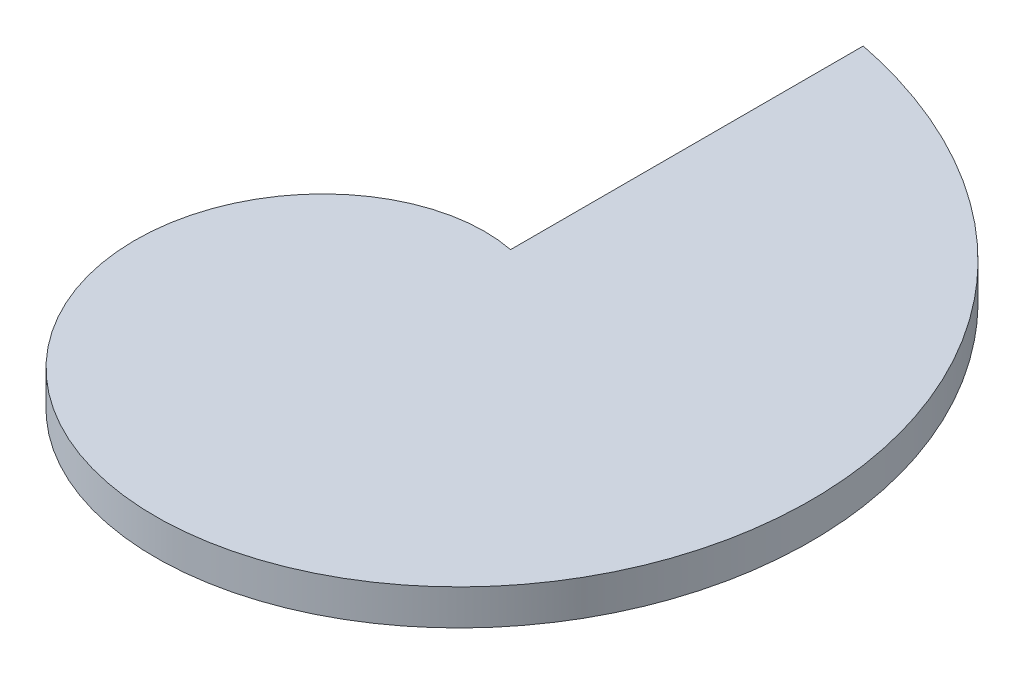
ISO-10303-21;
HEADER;
FILE_DESCRIPTION(('STEP AP214'),'2;1');
FILE_NAME('part.step','',(''),(''),'','','');
FILE_SCHEMA(('AUTOMOTIVE_DESIGN { 1 0 10303 214 1 1 1 1 }'));
ENDSEC;
DATA;
#1=APPLICATION_CONTEXT('core data for automotive mechanical design processes');
#2=APPLICATION_PROTOCOL_DEFINITION('international standard','automotive_design',2000,#1);
#3=PRODUCT_CONTEXT('',#1,'mechanical');
#4=PRODUCT('Part','Part','',(#3));
#5=PRODUCT_RELATED_PRODUCT_CATEGORY('part','',(#4));
#6=PRODUCT_DEFINITION_FORMATION('','',#4);
#7=PRODUCT_DEFINITION_CONTEXT('part definition',#1,'design');
#8=PRODUCT_DEFINITION('design','',#6,#7);
#9=PRODUCT_DEFINITION_SHAPE('','',#8);
#10=(LENGTH_UNIT() NAMED_UNIT(*) SI_UNIT(.MILLI.,.METRE.));
#11=(NAMED_UNIT(*) PLANE_ANGLE_UNIT() SI_UNIT($,.RADIAN.));
#12=(NAMED_UNIT(*) SI_UNIT($,.STERADIAN.) SOLID_ANGLE_UNIT());
#13=UNCERTAINTY_MEASURE_WITH_UNIT(LENGTH_MEASURE(1.E-05),#10,'distance_accuracy_value','');
#14=(GEOMETRIC_REPRESENTATION_CONTEXT(3) GLOBAL_UNCERTAINTY_ASSIGNED_CONTEXT((#13)) GLOBAL_UNIT_ASSIGNED_CONTEXT((#10,
#11,#12)) REPRESENTATION_CONTEXT('',''));
#15=CARTESIAN_POINT('',(0.,0.,0.));
#16=DIRECTION('',(0.,0.,1.));
#17=DIRECTION('',(1.,0.,0.));
#18=AXIS2_PLACEMENT_3D('',#15,#16,#17);
#19=CARTESIAN_POINT('',(4.09918138929294E-11,3.,-11.8318523933741));
#20=CARTESIAN_POINT('',(-0.102074488698328,3.,-11.8522721884606));
#21=CARTESIAN_POINT('',(-0.520314870022749,3.,-11.9309480322047));
#22=CARTESIAN_POINT('',(-1.26075925467651,3.,-12.03460775717));
#23=CARTESIAN_POINT('',(-2.32932541158136,3.,-12.0966089447191));
#24=CARTESIAN_POINT('',(-3.61605780583389,3.,-12.0391682601506));
#25=CARTESIAN_POINT('',(-4.89044623043018,3.,-11.8529208448876));
#26=CARTESIAN_POINT('',(-6.14025363583346,3.,-11.5422387710126));
#27=CARTESIAN_POINT('',(-7.35418514674133,3.,-11.1124573470327));
#28=CARTESIAN_POINT('',(-8.52192279040982,3.,-10.5697406315609));
#29=CARTESIAN_POINT('',(-9.63413488004002,3.,-9.92092498998573));
#30=CARTESIAN_POINT('',(-10.9445755091723,3.,-8.98654634783544));
#31=CARTESIAN_POINT('',(-12.3746674954571,3.,-7.68355860359343));
#32=CARTESIAN_POINT('',(-13.8074644361952,3.,-5.93420063927394));
#33=CARTESIAN_POINT('',(-15.0855040305825,3.,-3.68904249592776));
#34=CARTESIAN_POINT('',(-15.9814177625483,3.,-1.26672734129892));
#35=CARTESIAN_POINT('',(-16.4846979061729,3.,1.26575203741043));
#36=CARTESIAN_POINT('',(-16.595500654457,3.,3.84476471831828));
#37=CARTESIAN_POINT('',(-16.3230970739194,3.,6.41116599282036));
#38=CARTESIAN_POINT('',(-15.6843817136833,3.,8.91117856344863));
#39=CARTESIAN_POINT('',(-14.4569514968816,3.,11.8932185658297));
#40=CARTESIAN_POINT('',(-12.3533907468398,3.,15.1592985698417));
#41=CARTESIAN_POINT('',(-9.11833618820947,3.,18.358211882256));
#42=CARTESIAN_POINT('',(-3.90789782577074,3.,21.4165003564579));
#43=CARTESIAN_POINT('',(3.2630699962861,3.,23.1907235419384));
#44=CARTESIAN_POINT('',(10.682054261547,3.,22.418126513284));
#45=CARTESIAN_POINT('',(17.4048483344298,3.,19.3760187151935));
#46=CARTESIAN_POINT('',(22.4221796754052,3.,15.2947020739577));
#47=CARTESIAN_POINT('',(25.75705662128,3.,11.3408385151656));
#48=CARTESIAN_POINT('',(28.3276796967654,3.,6.85522941857424));
#49=CARTESIAN_POINT('',(30.0818599953336,3.,1.99352742908703));
#50=CARTESIAN_POINT('',(30.9970162201532,3.,-3.09140973141283));
#51=CARTESIAN_POINT('',(31.076106998164,3.,-8.25609832654813));
#52=CARTESIAN_POINT('',(30.4352716028662,3.,-12.7287855016));
#53=CARTESIAN_POINT('',(29.4052525894524,3.,-16.4549435805374));
#54=CARTESIAN_POINT('',(28.2440415127523,3.,-19.4555303077796));
#55=CARTESIAN_POINT('',(27.1410780593404,3.,-21.7811452156106));
#56=CARTESIAN_POINT('',(25.5553723298471,3.,-24.5805137861399));
#57=CARTESIAN_POINT('',(23.7084668102588,3.,-27.2192219395363));
#58=CARTESIAN_POINT('',(21.6237647198676,3.,-29.6738701175367));
#59=CARTESIAN_POINT('',(19.3262666943693,3.,-31.9256541755921));
#60=CARTESIAN_POINT('',(17.3707618493597,3.,-33.5987144538949));
#61=CARTESIAN_POINT('',(15.308102622745,3.,-35.137630187896));
#62=CARTESIAN_POINT('',(13.1486763544399,3.,-36.5374569015028));
#63=CARTESIAN_POINT('',(10.9029555270069,3.,-37.7940522848548));
#64=CARTESIAN_POINT('',(8.58128884081714,3.,-38.90406269364));
#65=CARTESIAN_POINT('',(6.49251512786946,3.,-39.7447482741173));
#66=CARTESIAN_POINT('',(4.66743969501344,3.,-40.3709019022982));
#67=CARTESIAN_POINT('',(3.28086308390007,3.,-40.7834647332361));
#68=CARTESIAN_POINT('',(2.34950451412777,3.,-41.0347325189563));
#69=CARTESIAN_POINT('',(1.64787235514153,3.,-41.2087531327561));
#70=CARTESIAN_POINT('',(1.17772547714883,3.,-41.3189879176875));
#71=CARTESIAN_POINT('',(0.785977655618433,3.,-41.4066785932219));
#72=CARTESIAN_POINT('',(0.479960129503798,3.,-41.472857838871));
#73=CARTESIAN_POINT('',(0.208617309583614,3.,-41.5289916472701));
#74=CARTESIAN_POINT('',(0.0688522749504607,3.,-41.5573601667327));
#75=CARTESIAN_POINT('',(4.50859382731811E-12,3.,-41.5711318416672));
#76=B_SPLINE_CURVE_WITH_KNOTS('',4,(#19,#20,#21,#22,#23,#24,#25,#26,#27,#28,#29,#30,#31,#32,#33,
#34,#35,#36,#37,#38,#39,#40,#41,#42,#43,#44,#45,#46,#47,#48,#49,#50,#51,#52,#53,#54,#55,#56,#57,
#58,#59,#60,#61,#62,#63,#64,#65,#66,#67,#68,#69,#70,#71,#72,#73,#74,#75),.UNSPECIFIED.,.F.,.F.,
(5,1,1,1,1,1,1,1,1,1,1,1,1,1,1,1,1,1,1,1,1,1,1,1,1,1,1,1,1,1,1,1,1,1,1,1,1,1,1,1,1,1,1,1,1,1,1,
1,1,1,1,1,1,5),(0.0849495890291299,0.0872218271673929,0.0942384892981048,0.101255151428817,
0.108271813559528,0.115288471320028,0.122305129080527,0.129321786841026,0.136338444601526,
0.143355105362374,0.150371766123222,0.164405087644918,0.178438419755713,0.192471751866509,
0.206505089131659,0.22053842639681,0.234571785909079,0.248605145421348,0.262638498378721,
0.276671851336094,0.304738506628471,0.332805129292762,0.360871888380826,0.407262735463008,
0.4633960730542,0.491462766079609,0.519529459105018,0.547596104153383,0.575662749201748,
0.603729401685902,0.631796054170056,0.659862692957512,0.687929331744968,0.701962700868322,
0.715996069991675,0.730029439115028,0.744062808238381,0.772129494541616,0.786162837693234,
0.800196180844852,0.814229517916738,0.828262854988625,0.842296192060511,0.856329529132398,
0.870362906170179,0.884396283207961,0.891412971726851,0.898429660245742,0.901938004505187,
0.905446348764633,0.907200520894356,0.908954693024078,0.910708865153801,0.91245961890649),.UNSPECIFIED.);
#77=DIRECTION('',(0.,-1.,0.));
#78=VECTOR('',#77,1.);
#79=SURFACE_OF_LINEAR_EXTRUSION('',#76,#78);
#80=CARTESIAN_POINT('',(4.09918138929294E-11,0.,-11.8318523933741));
#81=CARTESIAN_POINT('',(-0.102074488698328,0.,-11.8522721884606));
#82=CARTESIAN_POINT('',(-0.520314870022749,0.,-11.9309480322047));
#83=CARTESIAN_POINT('',(-1.26075925467651,0.,-12.03460775717));
#84=CARTESIAN_POINT('',(-2.32932541158136,0.,-12.0966089447191));
#85=CARTESIAN_POINT('',(-3.61605780583389,0.,-12.0391682601506));
#86=CARTESIAN_POINT('',(-4.89044623043018,0.,-11.8529208448876));
#87=CARTESIAN_POINT('',(-6.14025363583346,0.,-11.5422387710126));
#88=CARTESIAN_POINT('',(-7.35418514674133,0.,-11.1124573470327));
#89=CARTESIAN_POINT('',(-8.52192279040982,0.,-10.5697406315609));
#90=CARTESIAN_POINT('',(-9.63413488004002,0.,-9.92092498998573));
#91=CARTESIAN_POINT('',(-10.9445755091723,0.,-8.98654634783544));
#92=CARTESIAN_POINT('',(-12.3746674954571,0.,-7.68355860359343));
#93=CARTESIAN_POINT('',(-13.8074644361952,0.,-5.93420063927394));
#94=CARTESIAN_POINT('',(-15.0855040305825,0.,-3.68904249592776));
#95=CARTESIAN_POINT('',(-15.9814177625483,0.,-1.26672734129892));
#96=CARTESIAN_POINT('',(-16.4846979061729,0.,1.26575203741043));
#97=CARTESIAN_POINT('',(-16.595500654457,0.,3.84476471831828));
#98=CARTESIAN_POINT('',(-16.3230970739194,0.,6.41116599282036));
#99=CARTESIAN_POINT('',(-15.6843817136833,0.,8.91117856344863));
#100=CARTESIAN_POINT('',(-14.4569514968816,0.,11.8932185658297));
#101=CARTESIAN_POINT('',(-12.3533907468398,0.,15.1592985698417));
#102=CARTESIAN_POINT('',(-9.11833618820947,0.,18.358211882256));
#103=CARTESIAN_POINT('',(-3.90789782577074,0.,21.4165003564579));
#104=CARTESIAN_POINT('',(3.2630699962861,0.,23.1907235419384));
#105=CARTESIAN_POINT('',(10.682054261547,0.,22.418126513284));
#106=CARTESIAN_POINT('',(17.4048483344298,0.,19.3760187151935));
#107=CARTESIAN_POINT('',(22.4221796754052,0.,15.2947020739577));
#108=CARTESIAN_POINT('',(25.75705662128,0.,11.3408385151656));
#109=CARTESIAN_POINT('',(28.3276796967654,0.,6.85522941857424));
#110=CARTESIAN_POINT('',(30.0818599953336,0.,1.99352742908703));
#111=CARTESIAN_POINT('',(30.9970162201532,0.,-3.09140973141283));
#112=CARTESIAN_POINT('',(31.076106998164,0.,-8.25609832654813));
#113=CARTESIAN_POINT('',(30.4352716028662,0.,-12.7287855016));
#114=CARTESIAN_POINT('',(29.4052525894524,0.,-16.4549435805374));
#115=CARTESIAN_POINT('',(28.2440415127523,0.,-19.4555303077796));
#116=CARTESIAN_POINT('',(27.1410780593404,0.,-21.7811452156106));
#117=CARTESIAN_POINT('',(25.5553723298471,0.,-24.5805137861399));
#118=CARTESIAN_POINT('',(23.7084668102588,0.,-27.2192219395363));
#119=CARTESIAN_POINT('',(21.6237647198676,0.,-29.6738701175367));
#120=CARTESIAN_POINT('',(19.3262666943693,0.,-31.9256541755921));
#121=CARTESIAN_POINT('',(17.3707618493597,0.,-33.5987144538949));
#122=CARTESIAN_POINT('',(15.308102622745,0.,-35.137630187896));
#123=CARTESIAN_POINT('',(13.1486763544399,0.,-36.5374569015028));
#124=CARTESIAN_POINT('',(10.9029555270069,0.,-37.7940522848548));
#125=CARTESIAN_POINT('',(8.58128884081714,0.,-38.90406269364));
#126=CARTESIAN_POINT('',(6.49251512786946,0.,-39.7447482741173));
#127=CARTESIAN_POINT('',(4.66743969501344,0.,-40.3709019022982));
#128=CARTESIAN_POINT('',(3.28086308390007,0.,-40.7834647332361));
#129=CARTESIAN_POINT('',(2.34950451412777,0.,-41.0347325189563));
#130=CARTESIAN_POINT('',(1.64787235514153,0.,-41.2087531327561));
#131=CARTESIAN_POINT('',(1.17772547714883,0.,-41.3189879176875));
#132=CARTESIAN_POINT('',(0.785977655618433,0.,-41.4066785932219));
#133=CARTESIAN_POINT('',(0.479960129503798,0.,-41.472857838871));
#134=CARTESIAN_POINT('',(0.208617309583614,0.,-41.5289916472701));
#135=CARTESIAN_POINT('',(0.0688522749504607,0.,-41.5573601667327));
#136=CARTESIAN_POINT('',(4.50859382731811E-12,0.,-41.5711318416672));
#137=B_SPLINE_CURVE_WITH_KNOTS('',4,(#80,#81,#82,#83,#84,#85,#86,#87,#88,#89,#90,#91,#92,#93,
#94,#95,#96,#97,#98,#99,#100,#101,#102,#103,#104,#105,#106,#107,#108,#109,#110,#111,#112,#113,
#114,#115,#116,#117,#118,#119,#120,#121,#122,#123,#124,#125,#126,#127,#128,#129,#130,#131,#132,
#133,#134,#135,#136),.UNSPECIFIED.,.F.,.F.,(5,1,1,1,1,1,1,1,1,1,1,1,1,1,1,1,1,1,1,1,1,1,1,1,1,1,
1,1,1,1,1,1,1,1,1,1,1,1,1,1,1,1,1,1,1,1,1,1,1,1,1,1,1,5),(0.0849495890291299,0.0872218271673929,
0.0942384892981048,0.101255151428817,0.108271813559528,0.115288471320028,0.122305129080527,
0.129321786841026,0.136338444601526,0.143355105362374,0.150371766123222,0.164405087644918,
0.178438419755713,0.192471751866509,0.206505089131659,0.22053842639681,0.234571785909079,
0.248605145421348,0.262638498378721,0.276671851336094,0.304738506628471,0.332805129292762,
0.360871888380826,0.407262735463008,0.4633960730542,0.491462766079609,0.519529459105018,
0.547596104153383,0.575662749201748,0.603729401685902,0.631796054170056,0.659862692957512,
0.687929331744968,0.701962700868322,0.715996069991675,0.730029439115028,0.744062808238381,
0.772129494541616,0.786162837693234,0.800196180844852,0.814229517916738,0.828262854988625,
0.842296192060511,0.856329529132398,0.870362906170179,0.884396283207961,0.891412971726851,
0.898429660245742,0.901938004505187,0.905446348764633,0.907200520894356,0.908954693024078,
0.910708865153801,0.91245961890649),.UNSPECIFIED.);
#138=CARTESIAN_POINT('',(0.,0.,-11.8318523933823));
#139=VERTEX_POINT('',#138);
#140=CARTESIAN_POINT('',(0.,0.,-41.5711318416682));
#141=VERTEX_POINT('',#140);
#142=EDGE_CURVE('E65',#139,#141,#137,.T.);
#143=ORIENTED_EDGE('',*,*,#142,.T.);
#144=DIRECTION('',(0.,-1.,0.));
#145=VECTOR('',#144,1.);
#146=CARTESIAN_POINT('',(0.,3.,-41.5711318416682));
#147=LINE('',#146,#145);
#148=CARTESIAN_POINT('',(0.,3.,-41.5711318416682));
#149=VERTEX_POINT('',#148);
#150=EDGE_CURVE('E11',#149,#141,#147,.T.);
#151=ORIENTED_EDGE('',*,*,#150,.F.);
#152=CARTESIAN_POINT('',(0.,3.,-11.8318523933823));
#153=VERTEX_POINT('',#152);
#154=EDGE_CURVE('E64',#153,#149,#76,.T.);
#155=ORIENTED_EDGE('',*,*,#154,.F.);
#156=DIRECTION('',(0.,-1.,0.));
#157=VECTOR('',#156,1.);
#158=CARTESIAN_POINT('',(0.,3.,-11.8318523933823));
#159=LINE('',#158,#157);
#160=EDGE_CURVE('E42',#153,#139,#159,.T.);
#161=ORIENTED_EDGE('',*,*,#160,.T.);
#162=EDGE_LOOP('',(#143,#151,#155,#161));
#163=FACE_BOUND('',#162,.T.);
#164=ADVANCED_FACE('F33',(#163),#79,.F.);
#165=CARTESIAN_POINT('',(0.,3.,-41.5711318416682));
#166=DIRECTION('',(1.,0.,0.));
#167=DIRECTION('',(0.,0.,-1.));
#168=AXIS2_PLACEMENT_3D('',#165,#166,#167);
#169=PLANE('',#168);
#170=DIRECTION('',(0.,0.,1.));
#171=VECTOR('',#170,1.);
#172=CARTESIAN_POINT('',(0.,0.,-41.5711318416682));
#173=LINE('',#172,#171);
#174=EDGE_CURVE('E57',#141,#139,#173,.T.);
#175=ORIENTED_EDGE('',*,*,#174,.T.);
#176=ORIENTED_EDGE('',*,*,#160,.F.);
#177=DIRECTION('',(0.,0.,1.));
#178=VECTOR('',#177,1.);
#179=CARTESIAN_POINT('',(0.,3.,-41.5711318416682));
#180=LINE('',#179,#178);
#181=EDGE_CURVE('E49',#149,#153,#180,.T.);
#182=ORIENTED_EDGE('',*,*,#181,.F.);
#183=ORIENTED_EDGE('',*,*,#150,.T.);
#184=EDGE_LOOP('',(#175,#176,#182,#183));
#185=FACE_BOUND('',#184,.T.);
#186=ADVANCED_FACE('F60',(#185),#169,.F.);
#187=CARTESIAN_POINT('',(21.3732508642484,3.,16.0026319544815));
#188=DIRECTION('',(0.,-1.,0.));
#189=DIRECTION('',(0.,0.,-1.));
#190=AXIS2_PLACEMENT_3D('',#187,#188,#189);
#191=PLANE('',#190);
#192=ORIENTED_EDGE('',*,*,#154,.T.);
#193=ORIENTED_EDGE('',*,*,#181,.T.);
#194=EDGE_LOOP('',(#192,#193));
#195=FACE_BOUND('',#194,.T.);
#196=ADVANCED_FACE('F82',(#195),#191,.F.);
#197=CARTESIAN_POINT('',(21.3732508642484,0.,16.0026319544815));
#198=DIRECTION('',(0.,-1.,0.));
#199=DIRECTION('',(0.,0.,-1.));
#200=AXIS2_PLACEMENT_3D('',#197,#198,#199);
#201=PLANE('',#200);
#202=ORIENTED_EDGE('',*,*,#142,.F.);
#203=ORIENTED_EDGE('',*,*,#174,.F.);
#204=EDGE_LOOP('',(#202,#203));
#205=FACE_BOUND('',#204,.T.);
#206=ADVANCED_FACE('F68',(#205),#201,.T.);
#207=CLOSED_SHELL('',(#164,#186,#196,#206));
#208=MANIFOLD_SOLID_BREP('B2',#207);
#209=ADVANCED_BREP_SHAPE_REPRESENTATION('',(#18,#208),#14);
#210=SHAPE_DEFINITION_REPRESENTATION(#9,#209);
ENDSEC;
END-ISO-10303-21;
